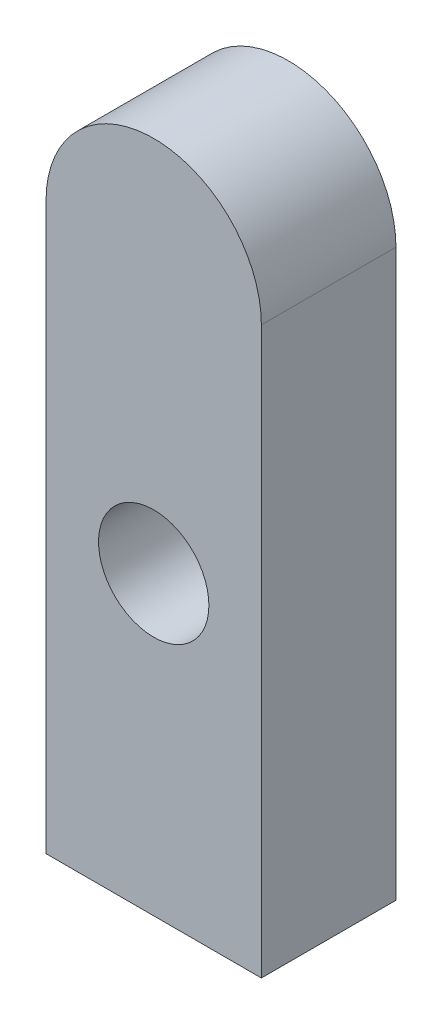
ISO-10303-21;
HEADER;
FILE_DESCRIPTION(('STEP AP214'),'2;1');
FILE_NAME('part.step','',(''),(''),'','','');
FILE_SCHEMA(('AUTOMOTIVE_DESIGN { 1 0 10303 214 1 1 1 1 }'));
ENDSEC;
DATA;
#1=APPLICATION_CONTEXT('core data for automotive mechanical design processes');
#2=APPLICATION_PROTOCOL_DEFINITION('international standard','automotive_design',2000,#1);
#3=PRODUCT_CONTEXT('',#1,'mechanical');
#4=PRODUCT('Part','Part','',(#3));
#5=PRODUCT_RELATED_PRODUCT_CATEGORY('part','',(#4));
#6=PRODUCT_DEFINITION_FORMATION('','',#4);
#7=PRODUCT_DEFINITION_CONTEXT('part definition',#1,'design');
#8=PRODUCT_DEFINITION('design','',#6,#7);
#9=PRODUCT_DEFINITION_SHAPE('','',#8);
#10=(LENGTH_UNIT() NAMED_UNIT(*) SI_UNIT(.MILLI.,.METRE.));
#11=(NAMED_UNIT(*) PLANE_ANGLE_UNIT() SI_UNIT($,.RADIAN.));
#12=(NAMED_UNIT(*) SI_UNIT($,.STERADIAN.) SOLID_ANGLE_UNIT());
#13=UNCERTAINTY_MEASURE_WITH_UNIT(LENGTH_MEASURE(1.E-05),#10,'distance_accuracy_value','');
#14=(GEOMETRIC_REPRESENTATION_CONTEXT(3) GLOBAL_UNCERTAINTY_ASSIGNED_CONTEXT((#13)) GLOBAL_UNIT_ASSIGNED_CONTEXT((#10,
#11,#12)) REPRESENTATION_CONTEXT('',''));
#15=CARTESIAN_POINT('',(0.,0.,0.));
#16=DIRECTION('',(0.,0.,1.));
#17=DIRECTION('',(1.,0.,0.));
#18=AXIS2_PLACEMENT_3D('',#15,#16,#17);
#19=CARTESIAN_POINT('',(0.,10.,2.5));
#20=DIRECTION('',(0.,0.,1.));
#21=DIRECTION('',(1.,0.,0.));
#22=AXIS2_PLACEMENT_3D('',#19,#20,#21);
#23=PLANE('',#22);
#24=DIRECTION('',(0.,-1.,0.));
#25=VECTOR('',#24,1.);
#26=CARTESIAN_POINT('',(-4.,0.,2.5));
#27=LINE('',#26,#25);
#28=CARTESIAN_POINT('',(-4.,10.,2.5));
#29=VERTEX_POINT('',#28);
#30=CARTESIAN_POINT('',(-4.,-11.0145584852302,2.5));
#31=VERTEX_POINT('',#30);
#32=EDGE_CURVE('E50',#29,#31,#27,.T.);
#33=ORIENTED_EDGE('',*,*,#32,.T.);
#34=DIRECTION('',(1.,0.,0.));
#35=VECTOR('',#34,1.);
#36=CARTESIAN_POINT('',(-4.,-11.0145584852302,2.5));
#37=LINE('',#36,#35);
#38=CARTESIAN_POINT('',(4.,-11.0145584852302,2.5));
#39=VERTEX_POINT('',#38);
#40=EDGE_CURVE('E80',#31,#39,#37,.T.);
#41=ORIENTED_EDGE('',*,*,#40,.T.);
#42=DIRECTION('',(0.,1.,0.));
#43=VECTOR('',#42,1.);
#44=CARTESIAN_POINT('',(4.,-11.0145584852302,2.5));
#45=LINE('',#44,#43);
#46=CARTESIAN_POINT('',(4.,10.,2.5));
#47=VERTEX_POINT('',#46);
#48=EDGE_CURVE('E84',#39,#47,#45,.T.);
#49=ORIENTED_EDGE('',*,*,#48,.T.);
#50=CARTESIAN_POINT('',(0.,10.,2.5));
#51=DIRECTION('',(0.,0.,1.));
#52=DIRECTION('',(1.,0.,0.));
#53=AXIS2_PLACEMENT_3D('',#50,#51,#52);
#54=CIRCLE('',#53,4.);
#55=EDGE_CURVE('E92',#47,#29,#54,.T.);
#56=ORIENTED_EDGE('',*,*,#55,.T.);
#57=EDGE_LOOP('',(#33,#41,#49,#56));
#58=FACE_BOUND('',#57,.T.);
#59=CARTESIAN_POINT('',(0.,0.,2.5));
#60=DIRECTION('',(0.,0.,1.));
#61=DIRECTION('',(1.,0.,0.));
#62=AXIS2_PLACEMENT_3D('',#59,#60,#61);
#63=CIRCLE('',#62,2.05);
#64=CARTESIAN_POINT('',(2.05,0.,2.5));
#65=VERTEX_POINT('',#64);
#66=EDGE_CURVE('E99',#65,#65,#63,.T.);
#67=ORIENTED_EDGE('',*,*,#66,.F.);
#68=EDGE_LOOP('',(#67));
#69=FACE_BOUND('',#68,.T.);
#70=ADVANCED_FACE('F33',(#58,#69),#23,.T.);
#71=CARTESIAN_POINT('',(0.,10.,-2.5));
#72=DIRECTION('',(0.,0.,1.));
#73=DIRECTION('',(1.,0.,0.));
#74=AXIS2_PLACEMENT_3D('',#71,#72,#73);
#75=PLANE('',#74);
#76=DIRECTION('',(1.,0.,0.));
#77=VECTOR('',#76,1.);
#78=CARTESIAN_POINT('',(-4.,-11.0145584852302,-2.5));
#79=LINE('',#78,#77);
#80=CARTESIAN_POINT('',(-4.,-11.0145584852302,-2.5));
#81=VERTEX_POINT('',#80);
#82=CARTESIAN_POINT('',(4.,-11.0145584852302,-2.5));
#83=VERTEX_POINT('',#82);
#84=EDGE_CURVE('E88',#81,#83,#79,.T.);
#85=ORIENTED_EDGE('',*,*,#84,.F.);
#86=DIRECTION('',(0.,-1.,0.));
#87=VECTOR('',#86,1.);
#88=CARTESIAN_POINT('',(-4.,0.,-2.5));
#89=LINE('',#88,#87);
#90=CARTESIAN_POINT('',(-4.,10.,-2.5));
#91=VERTEX_POINT('',#90);
#92=EDGE_CURVE('E102',#91,#81,#89,.T.);
#93=ORIENTED_EDGE('',*,*,#92,.F.);
#94=CARTESIAN_POINT('',(0.,10.,-2.5));
#95=DIRECTION('',(0.,0.,1.));
#96=DIRECTION('',(1.,0.,0.));
#97=AXIS2_PLACEMENT_3D('',#94,#95,#96);
#98=CIRCLE('',#97,4.);
#99=CARTESIAN_POINT('',(4.,10.,-2.5));
#100=VERTEX_POINT('',#99);
#101=EDGE_CURVE('E74',#100,#91,#98,.T.);
#102=ORIENTED_EDGE('',*,*,#101,.F.);
#103=DIRECTION('',(0.,1.,0.));
#104=VECTOR('',#103,1.);
#105=CARTESIAN_POINT('',(4.,0.,-2.5));
#106=LINE('',#105,#104);
#107=EDGE_CURVE('E67',#83,#100,#106,.T.);
#108=ORIENTED_EDGE('',*,*,#107,.F.);
#109=EDGE_LOOP('',(#85,#93,#102,#108));
#110=FACE_BOUND('',#109,.T.);
#111=CARTESIAN_POINT('',(0.,0.,-2.5));
#112=DIRECTION('',(0.,0.,1.));
#113=DIRECTION('',(1.,0.,0.));
#114=AXIS2_PLACEMENT_3D('',#111,#112,#113);
#115=CIRCLE('',#114,2.05);
#116=CARTESIAN_POINT('',(2.05,0.,-2.5));
#117=VERTEX_POINT('',#116);
#118=EDGE_CURVE('E178',#117,#117,#115,.T.);
#119=ORIENTED_EDGE('',*,*,#118,.T.);
#120=EDGE_LOOP('',(#119));
#121=FACE_BOUND('',#120,.T.);
#122=ADVANCED_FACE('F108',(#110,#121),#75,.F.);
#123=CARTESIAN_POINT('',(-4.,-11.0145584852302,2.5));
#124=DIRECTION('',(0.,1.,0.));
#125=DIRECTION('',(0.,0.,1.));
#126=AXIS2_PLACEMENT_3D('',#123,#124,#125);
#127=PLANE('',#126);
#128=ORIENTED_EDGE('',*,*,#84,.T.);
#129=DIRECTION('',(0.,0.,-1.));
#130=VECTOR('',#129,1.);
#131=CARTESIAN_POINT('',(4.,-11.0145584852302,2.5));
#132=LINE('',#131,#130);
#133=EDGE_CURVE('E42',#39,#83,#132,.T.);
#134=ORIENTED_EDGE('',*,*,#133,.F.);
#135=ORIENTED_EDGE('',*,*,#40,.F.);
#136=DIRECTION('',(0.,0.,-1.));
#137=VECTOR('',#136,1.);
#138=CARTESIAN_POINT('',(-4.,-11.0145584852302,2.5));
#139=LINE('',#138,#137);
#140=EDGE_CURVE('E11',#31,#81,#139,.T.);
#141=ORIENTED_EDGE('',*,*,#140,.T.);
#142=EDGE_LOOP('',(#128,#134,#135,#141));
#143=FACE_BOUND('',#142,.T.);
#144=ADVANCED_FACE('F35',(#143),#127,.F.);
#145=CARTESIAN_POINT('',(4.,0.,2.5));
#146=DIRECTION('',(-1.,0.,0.));
#147=DIRECTION('',(0.,0.,1.));
#148=AXIS2_PLACEMENT_3D('',#145,#146,#147);
#149=PLANE('',#148);
#150=ORIENTED_EDGE('',*,*,#107,.T.);
#151=DIRECTION('',(0.,0.,-1.));
#152=VECTOR('',#151,1.);
#153=CARTESIAN_POINT('',(4.,10.,2.5));
#154=LINE('',#153,#152);
#155=EDGE_CURVE('E89',#47,#100,#154,.T.);
#156=ORIENTED_EDGE('',*,*,#155,.F.);
#157=ORIENTED_EDGE('',*,*,#48,.F.);
#158=ORIENTED_EDGE('',*,*,#133,.T.);
#159=EDGE_LOOP('',(#150,#156,#157,#158));
#160=FACE_BOUND('',#159,.T.);
#161=ADVANCED_FACE('F90',(#160),#149,.F.);
#162=CARTESIAN_POINT('',(0.,10.,2.5));
#163=DIRECTION('',(0.,0.,-1.));
#164=DIRECTION('',(-1.,0.,0.));
#165=AXIS2_PLACEMENT_3D('',#162,#163,#164);
#166=CYLINDRICAL_SURFACE('',#165,4.);
#167=ORIENTED_EDGE('',*,*,#101,.T.);
#168=DIRECTION('',(0.,0.,-1.));
#169=VECTOR('',#168,1.);
#170=CARTESIAN_POINT('',(-4.,10.,2.5));
#171=LINE('',#170,#169);
#172=EDGE_CURVE('E94',#29,#91,#171,.T.);
#173=ORIENTED_EDGE('',*,*,#172,.F.);
#174=ORIENTED_EDGE('',*,*,#55,.F.);
#175=ORIENTED_EDGE('',*,*,#155,.T.);
#176=EDGE_LOOP('',(#167,#173,#174,#175));
#177=FACE_BOUND('',#176,.T.);
#178=ADVANCED_FACE('F105',(#177),#166,.T.);
#179=CARTESIAN_POINT('',(-4.,0.,2.5));
#180=DIRECTION('',(1.,0.,0.));
#181=DIRECTION('',(0.,0.,-1.));
#182=AXIS2_PLACEMENT_3D('',#179,#180,#181);
#183=PLANE('',#182);
#184=ORIENTED_EDGE('',*,*,#92,.T.);
#185=ORIENTED_EDGE('',*,*,#140,.F.);
#186=ORIENTED_EDGE('',*,*,#32,.F.);
#187=ORIENTED_EDGE('',*,*,#172,.T.);
#188=EDGE_LOOP('',(#184,#185,#186,#187));
#189=FACE_BOUND('',#188,.T.);
#190=ADVANCED_FACE('F110',(#189),#183,.F.);
#191=CARTESIAN_POINT('',(0.,0.,2.5));
#192=DIRECTION('',(0.,0.,-1.));
#193=DIRECTION('',(-1.,0.,0.));
#194=AXIS2_PLACEMENT_3D('',#191,#192,#193);
#195=CYLINDRICAL_SURFACE('',#194,2.05);
#196=ORIENTED_EDGE('',*,*,#66,.T.);
#197=EDGE_LOOP('',(#196));
#198=FACE_BOUND('',#197,.T.);
#199=ORIENTED_EDGE('',*,*,#118,.F.);
#200=EDGE_LOOP('',(#199));
#201=FACE_BOUND('',#200,.T.);
#202=ADVANCED_FACE('F112',(#198,#201),#195,.F.);
#203=CLOSED_SHELL('',(#70,#122,#144,#161,#178,#190,#202));
#204=MANIFOLD_SOLID_BREP('B2',#203);
#205=ADVANCED_BREP_SHAPE_REPRESENTATION('',(#18,#204),#14);
#206=SHAPE_DEFINITION_REPRESENTATION(#9,#205);
ENDSEC;
END-ISO-10303-21;
